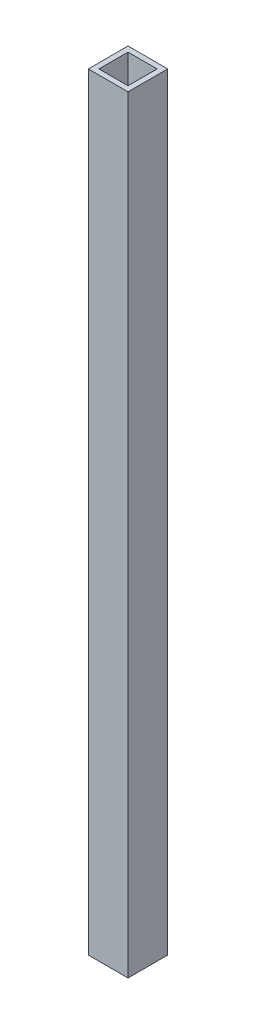
ISO-10303-21;
HEADER;
FILE_DESCRIPTION(('STEP AP214'),'2;1');
FILE_NAME('part.step','',(''),(''),'','','');
FILE_SCHEMA(('AUTOMOTIVE_DESIGN { 1 0 10303 214 1 1 1 1 }'));
ENDSEC;
DATA;
#1=APPLICATION_CONTEXT('core data for automotive mechanical design processes');
#2=APPLICATION_PROTOCOL_DEFINITION('international standard','automotive_design',2000,#1);
#3=PRODUCT_CONTEXT('',#1,'mechanical');
#4=PRODUCT('Part','Part','',(#3));
#5=PRODUCT_RELATED_PRODUCT_CATEGORY('part','',(#4));
#6=PRODUCT_DEFINITION_FORMATION('','',#4);
#7=PRODUCT_DEFINITION_CONTEXT('part definition',#1,'design');
#8=PRODUCT_DEFINITION('design','',#6,#7);
#9=PRODUCT_DEFINITION_SHAPE('','',#8);
#10=(LENGTH_UNIT() NAMED_UNIT(*) SI_UNIT(.MILLI.,.METRE.));
#11=(NAMED_UNIT(*) PLANE_ANGLE_UNIT() SI_UNIT($,.RADIAN.));
#12=(NAMED_UNIT(*) SI_UNIT($,.STERADIAN.) SOLID_ANGLE_UNIT());
#13=UNCERTAINTY_MEASURE_WITH_UNIT(LENGTH_MEASURE(1.E-05),#10,'distance_accuracy_value','');
#14=(GEOMETRIC_REPRESENTATION_CONTEXT(3) GLOBAL_UNCERTAINTY_ASSIGNED_CONTEXT((#13)) GLOBAL_UNIT_ASSIGNED_CONTEXT((#10,
#11,#12)) REPRESENTATION_CONTEXT('',''));
#15=CARTESIAN_POINT('',(0.,0.,0.));
#16=DIRECTION('',(0.,0.,1.));
#17=DIRECTION('',(1.,0.,0.));
#18=AXIS2_PLACEMENT_3D('',#15,#16,#17);
#19=CARTESIAN_POINT('',(0.,290.,0.));
#20=DIRECTION('',(0.,-1.,0.));
#21=DIRECTION('',(0.,0.,-1.));
#22=AXIS2_PLACEMENT_3D('',#19,#20,#21);
#23=PLANE('',#22);
#24=DIRECTION('',(0.,0.,1.));
#25=VECTOR('',#24,1.);
#26=CARTESIAN_POINT('',(0.,290.,0.));
#27=LINE('',#26,#25);
#28=CARTESIAN_POINT('',(0.,290.,-15.));
#29=VERTEX_POINT('',#28);
#30=CARTESIAN_POINT('',(0.,290.,0.));
#31=VERTEX_POINT('',#30);
#32=EDGE_CURVE('E157',#29,#31,#27,.T.);
#33=ORIENTED_EDGE('',*,*,#32,.T.);
#34=DIRECTION('',(1.,0.,0.));
#35=VECTOR('',#34,1.);
#36=CARTESIAN_POINT('',(0.,290.,0.));
#37=LINE('',#36,#35);
#38=CARTESIAN_POINT('',(15.,290.,0.));
#39=VERTEX_POINT('',#38);
#40=EDGE_CURVE('E161',#31,#39,#37,.T.);
#41=ORIENTED_EDGE('',*,*,#40,.T.);
#42=DIRECTION('',(0.,0.,-1.));
#43=VECTOR('',#42,1.);
#44=CARTESIAN_POINT('',(15.,290.,0.));
#45=LINE('',#44,#43);
#46=CARTESIAN_POINT('',(15.,290.,-15.));
#47=VERTEX_POINT('',#46);
#48=EDGE_CURVE('E165',#39,#47,#45,.T.);
#49=ORIENTED_EDGE('',*,*,#48,.T.);
#50=DIRECTION('',(-1.,0.,0.));
#51=VECTOR('',#50,1.);
#52=CARTESIAN_POINT('',(0.,290.,-15.));
#53=LINE('',#52,#51);
#54=EDGE_CURVE('E168',#47,#29,#53,.T.);
#55=ORIENTED_EDGE('',*,*,#54,.T.);
#56=EDGE_LOOP('',(#33,#41,#49,#55));
#57=FACE_BOUND('',#56,.T.);
#58=DIRECTION('',(1.,0.,0.));
#59=VECTOR('',#58,1.);
#60=CARTESIAN_POINT('',(2.,290.,-2.));
#61=LINE('',#60,#59);
#62=CARTESIAN_POINT('',(2.,290.,-2.));
#63=VERTEX_POINT('',#62);
#64=CARTESIAN_POINT('',(13.,290.,-2.));
#65=VERTEX_POINT('',#64);
#66=EDGE_CURVE('E109',#63,#65,#61,.T.);
#67=ORIENTED_EDGE('',*,*,#66,.F.);
#68=DIRECTION('',(0.,0.,1.));
#69=VECTOR('',#68,1.);
#70=CARTESIAN_POINT('',(2.,290.,-2.));
#71=LINE('',#70,#69);
#72=CARTESIAN_POINT('',(2.,290.,-13.));
#73=VERTEX_POINT('',#72);
#74=EDGE_CURVE('E135',#73,#63,#71,.T.);
#75=ORIENTED_EDGE('',*,*,#74,.F.);
#76=DIRECTION('',(-1.,0.,0.));
#77=VECTOR('',#76,1.);
#78=CARTESIAN_POINT('',(2.,290.,-13.));
#79=LINE('',#78,#77);
#80=CARTESIAN_POINT('',(13.,290.,-13.));
#81=VERTEX_POINT('',#80);
#82=EDGE_CURVE('E131',#81,#73,#79,.T.);
#83=ORIENTED_EDGE('',*,*,#82,.F.);
#84=DIRECTION('',(0.,0.,-1.));
#85=VECTOR('',#84,1.);
#86=CARTESIAN_POINT('',(13.,290.,-2.));
#87=LINE('',#86,#85);
#88=EDGE_CURVE('E118',#65,#81,#87,.T.);
#89=ORIENTED_EDGE('',*,*,#88,.F.);
#90=EDGE_LOOP('',(#67,#75,#83,#89));
#91=FACE_BOUND('',#90,.T.);
#92=ADVANCED_FACE('F43',(#57,#91),#23,.F.);
#93=CARTESIAN_POINT('',(0.,0.,0.));
#94=DIRECTION('',(0.,-1.,0.));
#95=DIRECTION('',(0.,0.,-1.));
#96=AXIS2_PLACEMENT_3D('',#93,#94,#95);
#97=PLANE('',#96);
#98=DIRECTION('',(0.,0.,1.));
#99=VECTOR('',#98,1.);
#100=CARTESIAN_POINT('',(0.,0.,0.));
#101=LINE('',#100,#99);
#102=CARTESIAN_POINT('',(0.,0.,-15.));
#103=VERTEX_POINT('',#102);
#104=CARTESIAN_POINT('',(0.,0.,0.));
#105=VERTEX_POINT('',#104);
#106=EDGE_CURVE('E127',#103,#105,#101,.T.);
#107=ORIENTED_EDGE('',*,*,#106,.F.);
#108=DIRECTION('',(-1.,0.,0.));
#109=VECTOR('',#108,1.);
#110=CARTESIAN_POINT('',(0.,0.,-15.));
#111=LINE('',#110,#109);
#112=CARTESIAN_POINT('',(15.,0.,-15.));
#113=VERTEX_POINT('',#112);
#114=EDGE_CURVE('E162',#113,#103,#111,.T.);
#115=ORIENTED_EDGE('',*,*,#114,.F.);
#116=DIRECTION('',(0.,0.,-1.));
#117=VECTOR('',#116,1.);
#118=CARTESIAN_POINT('',(15.,0.,0.));
#119=LINE('',#118,#117);
#120=CARTESIAN_POINT('',(15.,0.,0.));
#121=VERTEX_POINT('',#120);
#122=EDGE_CURVE('E178',#121,#113,#119,.T.);
#123=ORIENTED_EDGE('',*,*,#122,.F.);
#124=DIRECTION('',(1.,0.,0.));
#125=VECTOR('',#124,1.);
#126=CARTESIAN_POINT('',(0.,0.,0.));
#127=LINE('',#126,#125);
#128=EDGE_CURVE('E175',#105,#121,#127,.T.);
#129=ORIENTED_EDGE('',*,*,#128,.F.);
#130=EDGE_LOOP('',(#107,#115,#123,#129));
#131=FACE_BOUND('',#130,.T.);
#132=DIRECTION('',(0.,0.,1.));
#133=VECTOR('',#132,1.);
#134=CARTESIAN_POINT('',(2.,0.,-2.));
#135=LINE('',#134,#133);
#136=CARTESIAN_POINT('',(2.,0.,-13.));
#137=VERTEX_POINT('',#136);
#138=CARTESIAN_POINT('',(2.,0.,-2.));
#139=VERTEX_POINT('',#138);
#140=EDGE_CURVE('E119',#137,#139,#135,.T.);
#141=ORIENTED_EDGE('',*,*,#140,.T.);
#142=DIRECTION('',(1.,0.,0.));
#143=VECTOR('',#142,1.);
#144=CARTESIAN_POINT('',(2.,0.,-2.));
#145=LINE('',#144,#143);
#146=CARTESIAN_POINT('',(13.,0.,-2.));
#147=VERTEX_POINT('',#146);
#148=EDGE_CURVE('E67',#139,#147,#145,.T.);
#149=ORIENTED_EDGE('',*,*,#148,.T.);
#150=DIRECTION('',(0.,0.,-1.));
#151=VECTOR('',#150,1.);
#152=CARTESIAN_POINT('',(13.,0.,-2.));
#153=LINE('',#152,#151);
#154=CARTESIAN_POINT('',(13.,0.,-13.));
#155=VERTEX_POINT('',#154);
#156=EDGE_CURVE('E125',#147,#155,#153,.T.);
#157=ORIENTED_EDGE('',*,*,#156,.T.);
#158=DIRECTION('',(-1.,0.,0.));
#159=VECTOR('',#158,1.);
#160=CARTESIAN_POINT('',(2.,0.,-13.));
#161=LINE('',#160,#159);
#162=EDGE_CURVE('E144',#155,#137,#161,.T.);
#163=ORIENTED_EDGE('',*,*,#162,.T.);
#164=EDGE_LOOP('',(#141,#149,#157,#163));
#165=FACE_BOUND('',#164,.T.);
#166=ADVANCED_FACE('F201',(#131,#165),#97,.T.);
#167=CARTESIAN_POINT('',(0.,290.,0.));
#168=DIRECTION('',(1.,0.,0.));
#169=DIRECTION('',(0.,0.,-1.));
#170=AXIS2_PLACEMENT_3D('',#167,#168,#169);
#171=PLANE('',#170);
#172=ORIENTED_EDGE('',*,*,#106,.T.);
#173=DIRECTION('',(0.,-1.,0.));
#174=VECTOR('',#173,1.);
#175=CARTESIAN_POINT('',(0.,290.,0.));
#176=LINE('',#175,#174);
#177=EDGE_CURVE('E11',#31,#105,#176,.T.);
#178=ORIENTED_EDGE('',*,*,#177,.F.);
#179=ORIENTED_EDGE('',*,*,#32,.F.);
#180=DIRECTION('',(0.,-1.,0.));
#181=VECTOR('',#180,1.);
#182=CARTESIAN_POINT('',(0.,290.,-15.));
#183=LINE('',#182,#181);
#184=EDGE_CURVE('E171',#29,#103,#183,.T.);
#185=ORIENTED_EDGE('',*,*,#184,.T.);
#186=EDGE_LOOP('',(#172,#178,#179,#185));
#187=FACE_BOUND('',#186,.T.);
#188=ADVANCED_FACE('F45',(#187),#171,.F.);
#189=CARTESIAN_POINT('',(0.,290.,0.));
#190=DIRECTION('',(0.,0.,-1.));
#191=DIRECTION('',(-1.,0.,0.));
#192=AXIS2_PLACEMENT_3D('',#189,#190,#191);
#193=PLANE('',#192);
#194=ORIENTED_EDGE('',*,*,#128,.T.);
#195=DIRECTION('',(0.,-1.,0.));
#196=VECTOR('',#195,1.);
#197=CARTESIAN_POINT('',(15.,290.,0.));
#198=LINE('',#197,#196);
#199=EDGE_CURVE('E52',#39,#121,#198,.T.);
#200=ORIENTED_EDGE('',*,*,#199,.F.);
#201=ORIENTED_EDGE('',*,*,#40,.F.);
#202=ORIENTED_EDGE('',*,*,#177,.T.);
#203=EDGE_LOOP('',(#194,#200,#201,#202));
#204=FACE_BOUND('',#203,.T.);
#205=ADVANCED_FACE('F211',(#204),#193,.F.);
#206=CARTESIAN_POINT('',(15.,290.,0.));
#207=DIRECTION('',(-1.,0.,0.));
#208=DIRECTION('',(0.,0.,1.));
#209=AXIS2_PLACEMENT_3D('',#206,#207,#208);
#210=PLANE('',#209);
#211=ORIENTED_EDGE('',*,*,#122,.T.);
#212=DIRECTION('',(0.,-1.,0.));
#213=VECTOR('',#212,1.);
#214=CARTESIAN_POINT('',(15.,290.,-15.));
#215=LINE('',#214,#213);
#216=EDGE_CURVE('E186',#47,#113,#215,.T.);
#217=ORIENTED_EDGE('',*,*,#216,.F.);
#218=ORIENTED_EDGE('',*,*,#48,.F.);
#219=ORIENTED_EDGE('',*,*,#199,.T.);
#220=EDGE_LOOP('',(#211,#217,#218,#219));
#221=FACE_BOUND('',#220,.T.);
#222=ADVANCED_FACE('F195',(#221),#210,.F.);
#223=CARTESIAN_POINT('',(0.,290.,-15.));
#224=DIRECTION('',(0.,0.,1.));
#225=DIRECTION('',(1.,0.,0.));
#226=AXIS2_PLACEMENT_3D('',#223,#224,#225);
#227=PLANE('',#226);
#228=ORIENTED_EDGE('',*,*,#114,.T.);
#229=ORIENTED_EDGE('',*,*,#184,.F.);
#230=ORIENTED_EDGE('',*,*,#54,.F.);
#231=ORIENTED_EDGE('',*,*,#216,.T.);
#232=EDGE_LOOP('',(#228,#229,#230,#231));
#233=FACE_BOUND('',#232,.T.);
#234=ADVANCED_FACE('F205',(#233),#227,.F.);
#235=CARTESIAN_POINT('',(2.,290.,-2.));
#236=DIRECTION('',(0.,0.,-1.));
#237=DIRECTION('',(-1.,0.,0.));
#238=AXIS2_PLACEMENT_3D('',#235,#236,#237);
#239=PLANE('',#238);
#240=ORIENTED_EDGE('',*,*,#148,.F.);
#241=DIRECTION('',(0.,-1.,0.));
#242=VECTOR('',#241,1.);
#243=CARTESIAN_POINT('',(2.,290.,-2.));
#244=LINE('',#243,#242);
#245=EDGE_CURVE('E113',#63,#139,#244,.T.);
#246=ORIENTED_EDGE('',*,*,#245,.F.);
#247=ORIENTED_EDGE('',*,*,#66,.T.);
#248=DIRECTION('',(0.,-1.,0.));
#249=VECTOR('',#248,1.);
#250=CARTESIAN_POINT('',(13.,290.,-2.));
#251=LINE('',#250,#249);
#252=EDGE_CURVE('E112',#65,#147,#251,.T.);
#253=ORIENTED_EDGE('',*,*,#252,.T.);
#254=EDGE_LOOP('',(#240,#246,#247,#253));
#255=FACE_BOUND('',#254,.T.);
#256=ADVANCED_FACE('F111',(#255),#239,.T.);
#257=CARTESIAN_POINT('',(13.,290.,-2.));
#258=DIRECTION('',(-1.,0.,0.));
#259=DIRECTION('',(0.,0.,1.));
#260=AXIS2_PLACEMENT_3D('',#257,#258,#259);
#261=PLANE('',#260);
#262=ORIENTED_EDGE('',*,*,#156,.F.);
#263=ORIENTED_EDGE('',*,*,#252,.F.);
#264=ORIENTED_EDGE('',*,*,#88,.T.);
#265=DIRECTION('',(0.,-1.,0.));
#266=VECTOR('',#265,1.);
#267=CARTESIAN_POINT('',(13.,290.,-13.));
#268=LINE('',#267,#266);
#269=EDGE_CURVE('E128',#81,#155,#268,.T.);
#270=ORIENTED_EDGE('',*,*,#269,.T.);
#271=EDGE_LOOP('',(#262,#263,#264,#270));
#272=FACE_BOUND('',#271,.T.);
#273=ADVANCED_FACE('F122',(#272),#261,.T.);
#274=CARTESIAN_POINT('',(2.,290.,-13.));
#275=DIRECTION('',(0.,0.,1.));
#276=DIRECTION('',(1.,0.,0.));
#277=AXIS2_PLACEMENT_3D('',#274,#275,#276);
#278=PLANE('',#277);
#279=ORIENTED_EDGE('',*,*,#162,.F.);
#280=ORIENTED_EDGE('',*,*,#269,.F.);
#281=ORIENTED_EDGE('',*,*,#82,.T.);
#282=DIRECTION('',(0.,-1.,0.));
#283=VECTOR('',#282,1.);
#284=CARTESIAN_POINT('',(2.,290.,-13.));
#285=LINE('',#284,#283);
#286=EDGE_CURVE('E59',#73,#137,#285,.T.);
#287=ORIENTED_EDGE('',*,*,#286,.T.);
#288=EDGE_LOOP('',(#279,#280,#281,#287));
#289=FACE_BOUND('',#288,.T.);
#290=ADVANCED_FACE('F234',(#289),#278,.T.);
#291=CARTESIAN_POINT('',(2.,290.,-2.));
#292=DIRECTION('',(1.,0.,0.));
#293=DIRECTION('',(0.,0.,-1.));
#294=AXIS2_PLACEMENT_3D('',#291,#292,#293);
#295=PLANE('',#294);
#296=ORIENTED_EDGE('',*,*,#140,.F.);
#297=ORIENTED_EDGE('',*,*,#286,.F.);
#298=ORIENTED_EDGE('',*,*,#74,.T.);
#299=ORIENTED_EDGE('',*,*,#245,.T.);
#300=EDGE_LOOP('',(#296,#297,#298,#299));
#301=FACE_BOUND('',#300,.T.);
#302=ADVANCED_FACE('F238',(#301),#295,.T.);
#303=CLOSED_SHELL('',(#92,#166,#188,#205,#222,#234,#256,#273,#290,#302));
#304=MANIFOLD_SOLID_BREP('B2',#303);
#305=ADVANCED_BREP_SHAPE_REPRESENTATION('',(#18,#304),#14);
#306=SHAPE_DEFINITION_REPRESENTATION(#9,#305);
ENDSEC;
END-ISO-10303-21;
